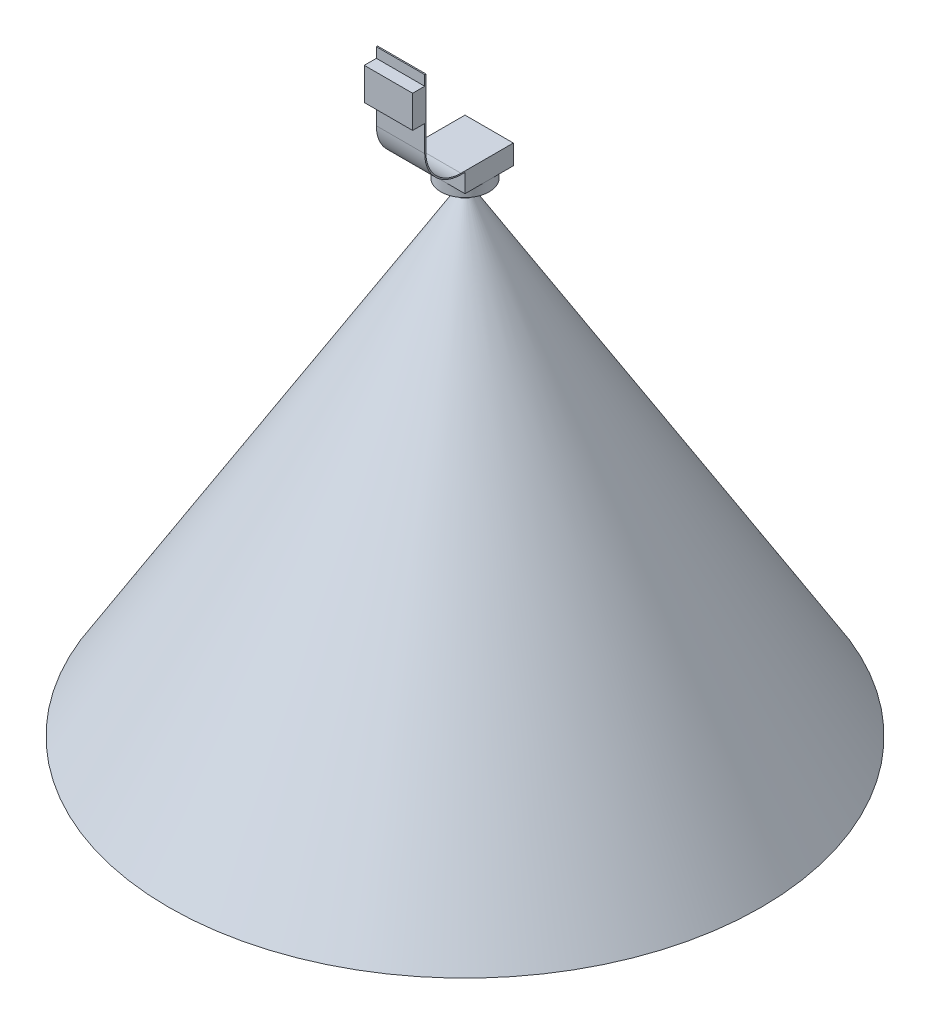
ISO-10303-21;
HEADER;
FILE_DESCRIPTION(('STEP AP214'),'2;1');
FILE_NAME('part.step','',(''),(''),'','','');
FILE_SCHEMA(('AUTOMOTIVE_DESIGN { 1 0 10303 214 1 1 1 1 }'));
ENDSEC;
DATA;
#1=APPLICATION_CONTEXT('core data for automotive mechanical design processes');
#2=APPLICATION_PROTOCOL_DEFINITION('international standard','automotive_design',2000,#1);
#3=PRODUCT_CONTEXT('',#1,'mechanical');
#4=PRODUCT('Part','Part','',(#3));
#5=PRODUCT_RELATED_PRODUCT_CATEGORY('part','',(#4));
#6=PRODUCT_DEFINITION_FORMATION('','',#4);
#7=PRODUCT_DEFINITION_CONTEXT('part definition',#1,'design');
#8=PRODUCT_DEFINITION('design','',#6,#7);
#9=PRODUCT_DEFINITION_SHAPE('','',#8);
#10=(LENGTH_UNIT() NAMED_UNIT(*) SI_UNIT(.MILLI.,.METRE.));
#11=(NAMED_UNIT(*) PLANE_ANGLE_UNIT() SI_UNIT($,.RADIAN.));
#12=(NAMED_UNIT(*) SI_UNIT($,.STERADIAN.) SOLID_ANGLE_UNIT());
#13=UNCERTAINTY_MEASURE_WITH_UNIT(LENGTH_MEASURE(1.E-05),#10,'distance_accuracy_value','');
#14=(GEOMETRIC_REPRESENTATION_CONTEXT(3) GLOBAL_UNCERTAINTY_ASSIGNED_CONTEXT((#13)) GLOBAL_UNIT_ASSIGNED_CONTEXT((#10,
#11,#12)) REPRESENTATION_CONTEXT('',''));
#15=CARTESIAN_POINT('',(0.,0.,0.));
#16=DIRECTION('',(0.,0.,1.));
#17=DIRECTION('',(1.,0.,0.));
#18=AXIS2_PLACEMENT_3D('',#15,#16,#17);
#19=CARTESIAN_POINT('',(-3.,13.,0.));
#20=DIRECTION('',(0.,0.,1.));
#21=DIRECTION('',(1.,0.,0.));
#22=AXIS2_PLACEMENT_3D('',#19,#20,#21);
#23=PLANE('',#22);
#24=DIRECTION('',(0.,1.,0.));
#25=VECTOR('',#24,1.);
#26=CARTESIAN_POINT('',(-3.,13.,0.));
#27=LINE('',#26,#25);
#28=CARTESIAN_POINT('',(-3.,13.,0.));
#29=VERTEX_POINT('',#28);
#30=CARTESIAN_POINT('',(-3.,11.75,0.));
#31=VERTEX_POINT('',#30);
#32=EDGE_CURVE('E393',#29,#31,#27,.F.);
#33=ORIENTED_EDGE('',*,*,#32,.T.);
#34=DIRECTION('',(1.,0.,0.));
#35=VECTOR('',#34,1.);
#36=CARTESIAN_POINT('',(3.,11.75,0.));
#37=LINE('',#36,#35);
#38=CARTESIAN_POINT('',(3.,11.75,0.));
#39=VERTEX_POINT('',#38);
#40=EDGE_CURVE('E362',#39,#31,#37,.F.);
#41=ORIENTED_EDGE('',*,*,#40,.F.);
#42=DIRECTION('',(0.,1.,0.));
#43=VECTOR('',#42,1.);
#44=CARTESIAN_POINT('',(3.,13.,0.));
#45=LINE('',#44,#43);
#46=CARTESIAN_POINT('',(3.,13.,0.));
#47=VERTEX_POINT('',#46);
#48=EDGE_CURVE('E398',#39,#47,#45,.T.);
#49=ORIENTED_EDGE('',*,*,#48,.T.);
#50=DIRECTION('',(1.,0.,0.));
#51=VECTOR('',#50,1.);
#52=CARTESIAN_POINT('',(-3.,13.,0.));
#53=LINE('',#52,#51);
#54=EDGE_CURVE('E376',#29,#47,#53,.T.);
#55=ORIENTED_EDGE('',*,*,#54,.F.);
#56=EDGE_LOOP('',(#33,#41,#49,#55));
#57=FACE_BOUND('',#56,.T.);
#58=ADVANCED_FACE('F16',(#57),#23,.T.);
#59=CARTESIAN_POINT('',(-3.,13.,-0.15));
#60=DIRECTION('',(0.,1.,0.));
#61=DIRECTION('',(0.,0.,1.));
#62=AXIS2_PLACEMENT_3D('',#59,#60,#61);
#63=PLANE('',#62);
#64=DIRECTION('',(-1.,0.,0.));
#65=VECTOR('',#64,1.);
#66=CARTESIAN_POINT('',(-3.,13.,-0.15));
#67=LINE('',#66,#65);
#68=CARTESIAN_POINT('',(-3.,13.,-0.15));
#69=VERTEX_POINT('',#68);
#70=CARTESIAN_POINT('',(3.,13.,-0.15));
#71=VERTEX_POINT('',#70);
#72=EDGE_CURVE('E343',#69,#71,#67,.F.);
#73=ORIENTED_EDGE('',*,*,#72,.F.);
#74=DIRECTION('',(0.,0.,1.));
#75=VECTOR('',#74,1.);
#76=CARTESIAN_POINT('',(-3.,13.,-0.15));
#77=LINE('',#76,#75);
#78=EDGE_CURVE('E368',#69,#29,#77,.T.);
#79=ORIENTED_EDGE('',*,*,#78,.T.);
#80=ORIENTED_EDGE('',*,*,#54,.T.);
#81=DIRECTION('',(0.,0.,1.));
#82=VECTOR('',#81,1.);
#83=CARTESIAN_POINT('',(3.,13.,-0.15));
#84=LINE('',#83,#82);
#85=EDGE_CURVE('E372',#47,#71,#84,.F.);
#86=ORIENTED_EDGE('',*,*,#85,.T.);
#87=EDGE_LOOP('',(#73,#79,#80,#86));
#88=FACE_BOUND('',#87,.T.);
#89=ADVANCED_FACE('F468',(#88),#63,.T.);
#90=CARTESIAN_POINT('',(3.,11.75,0.));
#91=DIRECTION('',(0.,1.,0.));
#92=DIRECTION('',(0.,0.,1.));
#93=AXIS2_PLACEMENT_3D('',#90,#91,#92);
#94=PLANE('',#93);
#95=DIRECTION('',(0.,0.,1.));
#96=VECTOR('',#95,1.);
#97=CARTESIAN_POINT('',(3.,11.75,0.));
#98=LINE('',#97,#96);
#99=CARTESIAN_POINT('',(3.,11.75,1.5));
#100=VERTEX_POINT('',#99);
#101=EDGE_CURVE('E406',#100,#39,#98,.F.);
#102=ORIENTED_EDGE('',*,*,#101,.T.);
#103=ORIENTED_EDGE('',*,*,#40,.T.);
#104=DIRECTION('',(0.,0.,1.));
#105=VECTOR('',#104,1.);
#106=CARTESIAN_POINT('',(-3.,11.75,0.));
#107=LINE('',#106,#105);
#108=CARTESIAN_POINT('',(-3.,11.75,1.5));
#109=VERTEX_POINT('',#108);
#110=EDGE_CURVE('E371',#31,#109,#107,.T.);
#111=ORIENTED_EDGE('',*,*,#110,.T.);
#112=DIRECTION('',(1.,0.,0.));
#113=VECTOR('',#112,1.);
#114=CARTESIAN_POINT('',(-3.,11.75,1.5));
#115=LINE('',#114,#113);
#116=EDGE_CURVE('E342',#100,#109,#115,.F.);
#117=ORIENTED_EDGE('',*,*,#116,.F.);
#118=EDGE_LOOP('',(#102,#103,#111,#117));
#119=FACE_BOUND('',#118,.T.);
#120=ADVANCED_FACE('F463',(#119),#94,.T.);
#121=CARTESIAN_POINT('',(-3.,7.75,0.));
#122=DIRECTION('',(0.,-1.,0.));
#123=DIRECTION('',(0.,0.,-1.));
#124=AXIS2_PLACEMENT_3D('',#121,#122,#123);
#125=PLANE('',#124);
#126=DIRECTION('',(0.,0.,-1.));
#127=VECTOR('',#126,1.);
#128=CARTESIAN_POINT('',(-3.,7.75,0.));
#129=LINE('',#128,#127);
#130=CARTESIAN_POINT('',(-3.,7.75,1.5));
#131=VERTEX_POINT('',#130);
#132=CARTESIAN_POINT('',(-3.,7.75,0.));
#133=VERTEX_POINT('',#132);
#134=EDGE_CURVE('E357',#131,#133,#129,.T.);
#135=ORIENTED_EDGE('',*,*,#134,.T.);
#136=DIRECTION('',(1.,0.,0.));
#137=VECTOR('',#136,1.);
#138=CARTESIAN_POINT('',(-3.,7.75,0.));
#139=LINE('',#138,#137);
#140=CARTESIAN_POINT('',(3.,7.75,0.));
#141=VERTEX_POINT('',#140);
#142=EDGE_CURVE('E332',#141,#133,#139,.F.);
#143=ORIENTED_EDGE('',*,*,#142,.F.);
#144=DIRECTION('',(0.,0.,-1.));
#145=VECTOR('',#144,1.);
#146=CARTESIAN_POINT('',(3.,7.75,0.));
#147=LINE('',#146,#145);
#148=CARTESIAN_POINT('',(3.,7.75,1.5));
#149=VERTEX_POINT('',#148);
#150=EDGE_CURVE('E360',#141,#149,#147,.F.);
#151=ORIENTED_EDGE('',*,*,#150,.T.);
#152=DIRECTION('',(1.,0.,0.));
#153=VECTOR('',#152,1.);
#154=CARTESIAN_POINT('',(-3.,7.75,1.5));
#155=LINE('',#154,#153);
#156=EDGE_CURVE('E333',#131,#149,#155,.T.);
#157=ORIENTED_EDGE('',*,*,#156,.F.);
#158=EDGE_LOOP('',(#135,#143,#151,#157));
#159=FACE_BOUND('',#158,.T.);
#160=ADVANCED_FACE('F456',(#159),#125,.T.);
#161=CARTESIAN_POINT('',(-3.,0.,-4.5));
#162=DIRECTION('',(0.,-1.,0.));
#163=DIRECTION('',(0.,0.,-1.));
#164=AXIS2_PLACEMENT_3D('',#161,#162,#163);
#165=PLANE('',#164);
#166=DIRECTION('',(0.,0.,-1.));
#167=VECTOR('',#166,1.);
#168=CARTESIAN_POINT('',(-3.,0.,0.));
#169=LINE('',#168,#167);
#170=CARTESIAN_POINT('',(-3.,0.,-4.5));
#171=VERTEX_POINT('',#170);
#172=CARTESIAN_POINT('',(-3.,0.,-5.));
#173=VERTEX_POINT('',#172);
#174=EDGE_CURVE('E162',#171,#173,#169,.T.);
#175=ORIENTED_EDGE('',*,*,#174,.T.);
#176=DIRECTION('',(1.,0.,0.));
#177=VECTOR('',#176,1.);
#178=CARTESIAN_POINT('',(-3.,0.,-5.));
#179=LINE('',#178,#177);
#180=CARTESIAN_POINT('',(3.,0.,-5.));
#181=VERTEX_POINT('',#180);
#182=EDGE_CURVE('E322',#181,#173,#179,.F.);
#183=ORIENTED_EDGE('',*,*,#182,.F.);
#184=DIRECTION('',(0.,0.,-1.));
#185=VECTOR('',#184,1.);
#186=CARTESIAN_POINT('',(3.,0.,-4.5));
#187=LINE('',#186,#185);
#188=CARTESIAN_POINT('',(3.,0.,-4.5));
#189=VERTEX_POINT('',#188);
#190=EDGE_CURVE('E164',#181,#189,#187,.F.);
#191=ORIENTED_EDGE('',*,*,#190,.T.);
#192=DIRECTION('',(1.,0.,0.));
#193=VECTOR('',#192,1.);
#194=CARTESIAN_POINT('',(-3.,0.,-4.5));
#195=LINE('',#194,#193);
#196=EDGE_CURVE('E158',#171,#189,#195,.T.);
#197=ORIENTED_EDGE('',*,*,#196,.F.);
#198=EDGE_LOOP('',(#175,#183,#191,#197));
#199=FACE_BOUND('',#198,.T.);
#200=ADVANCED_FACE('F159',(#199),#165,.T.);
#201=CARTESIAN_POINT('',(-3.,4.5,-4.5));
#202=DIRECTION('',(1.,0.,0.));
#203=DIRECTION('',(0.,0.,-1.));
#204=AXIS2_PLACEMENT_3D('',#201,#202,#203);
#205=CYLINDRICAL_SURFACE('',#204,4.5);
#206=DIRECTION('',(1.,0.,0.));
#207=VECTOR('',#206,1.);
#208=CARTESIAN_POINT('',(-3.,4.5,0.));
#209=LINE('',#208,#207);
#210=CARTESIAN_POINT('',(-3.,4.5,0.));
#211=VERTEX_POINT('',#210);
#212=CARTESIAN_POINT('',(3.,4.5,0.));
#213=VERTEX_POINT('',#212);
#214=EDGE_CURVE('E153',#211,#213,#209,.T.);
#215=ORIENTED_EDGE('',*,*,#214,.F.);
#216=CARTESIAN_POINT('',(-3.,4.5,-4.5));
#217=DIRECTION('',(1.,0.,0.));
#218=DIRECTION('',(0.,0.,-1.));
#219=AXIS2_PLACEMENT_3D('',#216,#217,#218);
#220=CIRCLE('',#219,4.5);
#221=EDGE_CURVE('E20',#211,#171,#220,.T.);
#222=ORIENTED_EDGE('',*,*,#221,.T.);
#223=ORIENTED_EDGE('',*,*,#196,.T.);
#224=CARTESIAN_POINT('',(3.,4.5,-4.5));
#225=DIRECTION('',(1.,0.,0.));
#226=DIRECTION('',(0.,0.,-1.));
#227=AXIS2_PLACEMENT_3D('',#224,#225,#226);
#228=CIRCLE('',#227,4.5);
#229=EDGE_CURVE('E318',#213,#189,#228,.T.);
#230=ORIENTED_EDGE('',*,*,#229,.F.);
#231=EDGE_LOOP('',(#215,#222,#223,#230));
#232=FACE_BOUND('',#231,.T.);
#233=ADVANCED_FACE('F169',(#232),#205,.T.);
#234=CARTESIAN_POINT('',(-3.,0.15,-11.));
#235=DIRECTION('',(0.,1.,0.));
#236=DIRECTION('',(0.,0.,1.));
#237=AXIS2_PLACEMENT_3D('',#234,#235,#236);
#238=PLANE('',#237);
#239=DIRECTION('',(-1.,0.,0.));
#240=VECTOR('',#239,1.);
#241=CARTESIAN_POINT('',(-3.,0.15,-11.));
#242=LINE('',#241,#240);
#243=CARTESIAN_POINT('',(-3.,0.15,-11.));
#244=VERTEX_POINT('',#243);
#245=CARTESIAN_POINT('',(3.,0.15,-11.));
#246=VERTEX_POINT('',#245);
#247=EDGE_CURVE('E336',#244,#246,#242,.F.);
#248=ORIENTED_EDGE('',*,*,#247,.F.);
#249=DIRECTION('',(0.,0.,-1.));
#250=VECTOR('',#249,1.);
#251=CARTESIAN_POINT('',(-3.,0.15,0.));
#252=LINE('',#251,#250);
#253=CARTESIAN_POINT('',(-3.,0.15,-4.5));
#254=VERTEX_POINT('',#253);
#255=EDGE_CURVE('E181',#244,#254,#252,.F.);
#256=ORIENTED_EDGE('',*,*,#255,.T.);
#257=DIRECTION('',(1.,0.,0.));
#258=VECTOR('',#257,1.);
#259=CARTESIAN_POINT('',(-3.,0.150000000000001,-4.5));
#260=LINE('',#259,#258);
#261=CARTESIAN_POINT('',(3.,0.15,-4.5));
#262=VERTEX_POINT('',#261);
#263=EDGE_CURVE('E166',#254,#262,#260,.T.);
#264=ORIENTED_EDGE('',*,*,#263,.T.);
#265=DIRECTION('',(0.,0.,-1.));
#266=VECTOR('',#265,1.);
#267=CARTESIAN_POINT('',(3.,0.15,0.));
#268=LINE('',#267,#266);
#269=EDGE_CURVE('E206',#246,#262,#268,.F.);
#270=ORIENTED_EDGE('',*,*,#269,.F.);
#271=EDGE_LOOP('',(#248,#256,#264,#270));
#272=FACE_BOUND('',#271,.T.);
#273=ADVANCED_FACE('F475',(#272),#238,.T.);
#274=CARTESIAN_POINT('',(-3.,4.5,-4.5));
#275=DIRECTION('',(1.,0.,0.));
#276=DIRECTION('',(0.,0.,-1.));
#277=AXIS2_PLACEMENT_3D('',#274,#275,#276);
#278=CYLINDRICAL_SURFACE('',#277,4.35);
#279=CARTESIAN_POINT('',(3.,4.5,-4.5));
#280=DIRECTION('',(1.,0.,0.));
#281=DIRECTION('',(0.,0.,-1.));
#282=AXIS2_PLACEMENT_3D('',#279,#280,#281);
#283=CIRCLE('',#282,4.35);
#284=CARTESIAN_POINT('',(3.,4.5,-0.15));
#285=VERTEX_POINT('',#284);
#286=EDGE_CURVE('E203',#262,#285,#283,.F.);
#287=ORIENTED_EDGE('',*,*,#286,.F.);
#288=ORIENTED_EDGE('',*,*,#263,.F.);
#289=CARTESIAN_POINT('',(-3.,4.5,-4.5));
#290=DIRECTION('',(1.,0.,0.));
#291=DIRECTION('',(0.,0.,-1.));
#292=AXIS2_PLACEMENT_3D('',#289,#290,#291);
#293=CIRCLE('',#292,4.35);
#294=CARTESIAN_POINT('',(-3.,4.5,-0.15));
#295=VERTEX_POINT('',#294);
#296=EDGE_CURVE('E434',#254,#295,#293,.F.);
#297=ORIENTED_EDGE('',*,*,#296,.T.);
#298=DIRECTION('',(-1.,0.,0.));
#299=VECTOR('',#298,1.);
#300=CARTESIAN_POINT('',(-3.,4.5,-0.15));
#301=LINE('',#300,#299);
#302=EDGE_CURVE('E339',#285,#295,#301,.T.);
#303=ORIENTED_EDGE('',*,*,#302,.F.);
#304=EDGE_LOOP('',(#287,#288,#297,#303));
#305=FACE_BOUND('',#304,.T.);
#306=ADVANCED_FACE('F473',(#305),#278,.F.);
#307=CARTESIAN_POINT('',(-3.,4.5,-0.15));
#308=DIRECTION('',(0.,0.,-1.));
#309=DIRECTION('',(-1.,0.,0.));
#310=AXIS2_PLACEMENT_3D('',#307,#308,#309);
#311=PLANE('',#310);
#312=ORIENTED_EDGE('',*,*,#302,.T.);
#313=DIRECTION('',(0.,1.,0.));
#314=VECTOR('',#313,1.);
#315=CARTESIAN_POINT('',(-3.,0.,-0.15));
#316=LINE('',#315,#314);
#317=EDGE_CURVE('E353',#295,#69,#316,.T.);
#318=ORIENTED_EDGE('',*,*,#317,.T.);
#319=ORIENTED_EDGE('',*,*,#72,.T.);
#320=DIRECTION('',(0.,1.,0.));
#321=VECTOR('',#320,1.);
#322=CARTESIAN_POINT('',(3.,0.,-0.15));
#323=LINE('',#322,#321);
#324=EDGE_CURVE('E200',#285,#71,#323,.T.);
#325=ORIENTED_EDGE('',*,*,#324,.F.);
#326=EDGE_LOOP('',(#312,#318,#319,#325));
#327=FACE_BOUND('',#326,.T.);
#328=ADVANCED_FACE('F471',(#327),#311,.T.);
#329=CARTESIAN_POINT('',(-3.,0.,1.5));
#330=DIRECTION('',(0.,0.,1.));
#331=DIRECTION('',(1.,0.,0.));
#332=AXIS2_PLACEMENT_3D('',#329,#330,#331);
#333=PLANE('',#332);
#334=ORIENTED_EDGE('',*,*,#156,.T.);
#335=DIRECTION('',(0.,1.,0.));
#336=VECTOR('',#335,1.);
#337=CARTESIAN_POINT('',(3.,0.,1.5));
#338=LINE('',#337,#336);
#339=EDGE_CURVE('E197',#100,#149,#338,.F.);
#340=ORIENTED_EDGE('',*,*,#339,.F.);
#341=ORIENTED_EDGE('',*,*,#116,.T.);
#342=DIRECTION('',(0.,1.,0.));
#343=VECTOR('',#342,1.);
#344=CARTESIAN_POINT('',(-3.,0.,1.5));
#345=LINE('',#344,#343);
#346=EDGE_CURVE('E190',#109,#131,#345,.F.);
#347=ORIENTED_EDGE('',*,*,#346,.T.);
#348=EDGE_LOOP('',(#334,#340,#341,#347));
#349=FACE_BOUND('',#348,.T.);
#350=ADVANCED_FACE('F450',(#349),#333,.T.);
#351=CARTESIAN_POINT('',(-3.,13.,0.));
#352=DIRECTION('',(0.,0.,1.));
#353=DIRECTION('',(1.,0.,0.));
#354=AXIS2_PLACEMENT_3D('',#351,#352,#353);
#355=PLANE('',#354);
#356=DIRECTION('',(0.,1.,0.));
#357=VECTOR('',#356,1.);
#358=CARTESIAN_POINT('',(3.,0.,0.));
#359=LINE('',#358,#357);
#360=EDGE_CURVE('E193',#141,#213,#359,.F.);
#361=ORIENTED_EDGE('',*,*,#360,.F.);
#362=ORIENTED_EDGE('',*,*,#142,.T.);
#363=DIRECTION('',(0.,1.,0.));
#364=VECTOR('',#363,1.);
#365=CARTESIAN_POINT('',(-3.,0.,0.));
#366=LINE('',#365,#364);
#367=EDGE_CURVE('E172',#133,#211,#366,.F.);
#368=ORIENTED_EDGE('',*,*,#367,.T.);
#369=ORIENTED_EDGE('',*,*,#214,.T.);
#370=EDGE_LOOP('',(#361,#362,#368,#369));
#371=FACE_BOUND('',#370,.T.);
#372=ADVANCED_FACE('F503',(#371),#355,.T.);
#373=CARTESIAN_POINT('',(-3.,0.,-11.));
#374=DIRECTION('',(0.,0.,-1.));
#375=DIRECTION('',(-1.,0.,0.));
#376=AXIS2_PLACEMENT_3D('',#373,#374,#375);
#377=PLANE('',#376);
#378=DIRECTION('',(1.,0.,0.));
#379=VECTOR('',#378,1.);
#380=CARTESIAN_POINT('',(-3.,-2.3,-11.));
#381=LINE('',#380,#379);
#382=CARTESIAN_POINT('',(3.,-2.3,-11.));
#383=VERTEX_POINT('',#382);
#384=CARTESIAN_POINT('',(0.,-2.3,-11.));
#385=VERTEX_POINT('',#384);
#386=EDGE_CURVE('E212',#383,#385,#381,.F.);
#387=ORIENTED_EDGE('',*,*,#386,.T.);
#388=DIRECTION('',(1.,0.,0.));
#389=VECTOR('',#388,1.);
#390=CARTESIAN_POINT('',(-3.,-2.3,-11.));
#391=LINE('',#390,#389);
#392=CARTESIAN_POINT('',(-3.,-2.3,-11.));
#393=VERTEX_POINT('',#392);
#394=EDGE_CURVE('E214',#385,#393,#391,.F.);
#395=ORIENTED_EDGE('',*,*,#394,.T.);
#396=DIRECTION('',(0.,1.,0.));
#397=VECTOR('',#396,1.);
#398=CARTESIAN_POINT('',(-3.,0.,-11.));
#399=LINE('',#398,#397);
#400=EDGE_CURVE('E178',#393,#244,#399,.T.);
#401=ORIENTED_EDGE('',*,*,#400,.T.);
#402=ORIENTED_EDGE('',*,*,#247,.T.);
#403=DIRECTION('',(0.,1.,0.));
#404=VECTOR('',#403,1.);
#405=CARTESIAN_POINT('',(3.,0.,-11.));
#406=LINE('',#405,#404);
#407=EDGE_CURVE('E209',#383,#246,#406,.T.);
#408=ORIENTED_EDGE('',*,*,#407,.F.);
#409=EDGE_LOOP('',(#387,#395,#401,#402,#408));
#410=FACE_BOUND('',#409,.T.);
#411=ADVANCED_FACE('F478',(#410),#377,.T.);
#412=CARTESIAN_POINT('',(-3.,0.,0.));
#413=DIRECTION('',(1.,0.,0.));
#414=DIRECTION('',(0.,0.,-1.));
#415=AXIS2_PLACEMENT_3D('',#412,#413,#414);
#416=PLANE('',#415);
#417=ORIENTED_EDGE('',*,*,#317,.F.);
#418=ORIENTED_EDGE('',*,*,#296,.F.);
#419=ORIENTED_EDGE('',*,*,#255,.F.);
#420=ORIENTED_EDGE('',*,*,#400,.F.);
#421=DIRECTION('',(0.,0.,1.));
#422=VECTOR('',#421,1.);
#423=CARTESIAN_POINT('',(-3.,-2.3,0.));
#424=LINE('',#423,#422);
#425=CARTESIAN_POINT('',(-3.,-2.3,-8.));
#426=VERTEX_POINT('',#425);
#427=EDGE_CURVE('E221',#393,#426,#424,.T.);
#428=ORIENTED_EDGE('',*,*,#427,.T.);
#429=DIRECTION('',(0.,0.,1.));
#430=VECTOR('',#429,1.);
#431=CARTESIAN_POINT('',(-3.,-2.3,0.));
#432=LINE('',#431,#430);
#433=CARTESIAN_POINT('',(-3.,-2.3,-5.));
#434=VERTEX_POINT('',#433);
#435=EDGE_CURVE('E223',#426,#434,#432,.T.);
#436=ORIENTED_EDGE('',*,*,#435,.T.);
#437=DIRECTION('',(0.,1.,0.));
#438=VECTOR('',#437,1.);
#439=CARTESIAN_POINT('',(-3.,0.,-5.));
#440=LINE('',#439,#438);
#441=EDGE_CURVE('E176',#173,#434,#440,.F.);
#442=ORIENTED_EDGE('',*,*,#441,.F.);
#443=ORIENTED_EDGE('',*,*,#174,.F.);
#444=ORIENTED_EDGE('',*,*,#221,.F.);
#445=ORIENTED_EDGE('',*,*,#367,.F.);
#446=ORIENTED_EDGE('',*,*,#134,.F.);
#447=ORIENTED_EDGE('',*,*,#346,.F.);
#448=ORIENTED_EDGE('',*,*,#110,.F.);
#449=ORIENTED_EDGE('',*,*,#32,.F.);
#450=ORIENTED_EDGE('',*,*,#78,.F.);
#451=EDGE_LOOP('',(#417,#418,#419,#420,#428,#436,#442,#443,#444,#445,#446,#447,#448,#449,#450));
#452=FACE_BOUND('',#451,.T.);
#453=ADVANCED_FACE('F174',(#452),#416,.F.);
#454=CARTESIAN_POINT('',(-3.,0.,-5.));
#455=DIRECTION('',(0.,0.,1.));
#456=DIRECTION('',(1.,0.,0.));
#457=AXIS2_PLACEMENT_3D('',#454,#455,#456);
#458=PLANE('',#457);
#459=DIRECTION('',(1.,0.,0.));
#460=VECTOR('',#459,1.);
#461=CARTESIAN_POINT('',(-3.,-2.3,-5.));
#462=LINE('',#461,#460);
#463=CARTESIAN_POINT('',(0.,-2.3,-5.));
#464=VERTEX_POINT('',#463);
#465=EDGE_CURVE('E229',#434,#464,#462,.T.);
#466=ORIENTED_EDGE('',*,*,#465,.T.);
#467=DIRECTION('',(1.,0.,0.));
#468=VECTOR('',#467,1.);
#469=CARTESIAN_POINT('',(-3.,-2.3,-5.));
#470=LINE('',#469,#468);
#471=CARTESIAN_POINT('',(3.,-2.3,-5.));
#472=VERTEX_POINT('',#471);
#473=EDGE_CURVE('E231',#464,#472,#470,.T.);
#474=ORIENTED_EDGE('',*,*,#473,.T.);
#475=DIRECTION('',(0.,1.,0.));
#476=VECTOR('',#475,1.);
#477=CARTESIAN_POINT('',(3.,0.,-5.));
#478=LINE('',#477,#476);
#479=EDGE_CURVE('E315',#181,#472,#478,.F.);
#480=ORIENTED_EDGE('',*,*,#479,.F.);
#481=ORIENTED_EDGE('',*,*,#182,.T.);
#482=ORIENTED_EDGE('',*,*,#441,.T.);
#483=EDGE_LOOP('',(#466,#474,#480,#481,#482));
#484=FACE_BOUND('',#483,.T.);
#485=ADVANCED_FACE('F499',(#484),#458,.T.);
#486=CARTESIAN_POINT('',(3.,0.,0.));
#487=DIRECTION('',(1.,0.,0.));
#488=DIRECTION('',(0.,0.,-1.));
#489=AXIS2_PLACEMENT_3D('',#486,#487,#488);
#490=PLANE('',#489);
#491=ORIENTED_EDGE('',*,*,#150,.F.);
#492=ORIENTED_EDGE('',*,*,#360,.T.);
#493=ORIENTED_EDGE('',*,*,#229,.T.);
#494=ORIENTED_EDGE('',*,*,#190,.F.);
#495=ORIENTED_EDGE('',*,*,#479,.T.);
#496=DIRECTION('',(0.,0.,1.));
#497=VECTOR('',#496,1.);
#498=CARTESIAN_POINT('',(3.,-2.3,0.));
#499=LINE('',#498,#497);
#500=CARTESIAN_POINT('',(3.,-2.3,-8.));
#501=VERTEX_POINT('',#500);
#502=EDGE_CURVE('E237',#472,#501,#499,.F.);
#503=ORIENTED_EDGE('',*,*,#502,.T.);
#504=DIRECTION('',(0.,0.,1.));
#505=VECTOR('',#504,1.);
#506=CARTESIAN_POINT('',(3.,-2.3,0.));
#507=LINE('',#506,#505);
#508=EDGE_CURVE('E196',#501,#383,#507,.F.);
#509=ORIENTED_EDGE('',*,*,#508,.T.);
#510=ORIENTED_EDGE('',*,*,#407,.T.);
#511=ORIENTED_EDGE('',*,*,#269,.T.);
#512=ORIENTED_EDGE('',*,*,#286,.T.);
#513=ORIENTED_EDGE('',*,*,#324,.T.);
#514=ORIENTED_EDGE('',*,*,#85,.F.);
#515=ORIENTED_EDGE('',*,*,#48,.F.);
#516=ORIENTED_EDGE('',*,*,#101,.F.);
#517=ORIENTED_EDGE('',*,*,#339,.T.);
#518=EDGE_LOOP('',(#491,#492,#493,#494,#495,#503,#509,#510,#511,#512,#513,#514,#515,#516,#517));
#519=FACE_BOUND('',#518,.T.);
#520=ADVANCED_FACE('F459',(#519),#490,.T.);
#521=CARTESIAN_POINT('',(-3.,-2.3,0.));
#522=DIRECTION('',(0.,1.,0.));
#523=DIRECTION('',(0.,0.,1.));
#524=AXIS2_PLACEMENT_3D('',#521,#522,#523);
#525=PLANE('',#524);
#526=ORIENTED_EDGE('',*,*,#386,.F.);
#527=ORIENTED_EDGE('',*,*,#508,.F.);
#528=CARTESIAN_POINT('',(0.,-2.3,-8.));
#529=DIRECTION('',(0.,-1.,0.));
#530=DIRECTION('',(0.,0.,-1.));
#531=AXIS2_PLACEMENT_3D('',#528,#529,#530);
#532=CIRCLE('',#531,3.);
#533=EDGE_CURVE('E239',#385,#501,#532,.T.);
#534=ORIENTED_EDGE('',*,*,#533,.F.);
#535=EDGE_LOOP('',(#526,#527,#534));
#536=FACE_BOUND('',#535,.T.);
#537=ADVANCED_FACE('F609',(#536),#525,.F.);
#538=CARTESIAN_POINT('',(-3.,-2.3,0.));
#539=DIRECTION('',(0.,1.,0.));
#540=DIRECTION('',(0.,0.,1.));
#541=AXIS2_PLACEMENT_3D('',#538,#539,#540);
#542=PLANE('',#541);
#543=ORIENTED_EDGE('',*,*,#394,.F.);
#544=CARTESIAN_POINT('',(0.,-2.3,-8.));
#545=DIRECTION('',(0.,-1.,0.));
#546=DIRECTION('',(0.,0.,-1.));
#547=AXIS2_PLACEMENT_3D('',#544,#545,#546);
#548=CIRCLE('',#547,3.);
#549=EDGE_CURVE('E427',#426,#385,#548,.T.);
#550=ORIENTED_EDGE('',*,*,#549,.F.);
#551=ORIENTED_EDGE('',*,*,#427,.F.);
#552=EDGE_LOOP('',(#543,#550,#551));
#553=FACE_BOUND('',#552,.T.);
#554=ADVANCED_FACE('F483',(#553),#542,.F.);
#555=CARTESIAN_POINT('',(-3.,-2.3,0.));
#556=DIRECTION('',(0.,1.,0.));
#557=DIRECTION('',(0.,0.,1.));
#558=AXIS2_PLACEMENT_3D('',#555,#556,#557);
#559=PLANE('',#558);
#560=ORIENTED_EDGE('',*,*,#465,.F.);
#561=ORIENTED_EDGE('',*,*,#435,.F.);
#562=CARTESIAN_POINT('',(0.,-2.3,-8.));
#563=DIRECTION('',(0.,-1.,0.));
#564=DIRECTION('',(0.,0.,-1.));
#565=AXIS2_PLACEMENT_3D('',#562,#563,#564);
#566=CIRCLE('',#565,3.);
#567=EDGE_CURVE('E424',#464,#426,#566,.T.);
#568=ORIENTED_EDGE('',*,*,#567,.F.);
#569=EDGE_LOOP('',(#560,#561,#568));
#570=FACE_BOUND('',#569,.T.);
#571=ADVANCED_FACE('F489',(#570),#559,.F.);
#572=CARTESIAN_POINT('',(-3.,-2.3,0.));
#573=DIRECTION('',(0.,1.,0.));
#574=DIRECTION('',(0.,0.,1.));
#575=AXIS2_PLACEMENT_3D('',#572,#573,#574);
#576=PLANE('',#575);
#577=ORIENTED_EDGE('',*,*,#473,.F.);
#578=CARTESIAN_POINT('',(0.,-2.3,-8.));
#579=DIRECTION('',(0.,-1.,0.));
#580=DIRECTION('',(0.,0.,-1.));
#581=AXIS2_PLACEMENT_3D('',#578,#579,#580);
#582=CIRCLE('',#581,3.);
#583=EDGE_CURVE('E421',#501,#464,#582,.T.);
#584=ORIENTED_EDGE('',*,*,#583,.F.);
#585=ORIENTED_EDGE('',*,*,#502,.F.);
#586=EDGE_LOOP('',(#577,#584,#585));
#587=FACE_BOUND('',#586,.T.);
#588=ADVANCED_FACE('F496',(#587),#576,.F.);
#589=CARTESIAN_POINT('',(0.,-2.3,-8.));
#590=DIRECTION('',(0.,-1.,0.));
#591=DIRECTION('',(0.,0.,-1.));
#592=AXIS2_PLACEMENT_3D('',#589,#590,#591);
#593=CYLINDRICAL_SURFACE('',#592,3.);
#594=CARTESIAN_POINT('',(0.,-3.6,-8.));
#595=DIRECTION('',(0.,-1.,0.));
#596=DIRECTION('',(0.,0.,-1.));
#597=AXIS2_PLACEMENT_3D('',#594,#595,#596);
#598=CIRCLE('',#597,3.);
#599=CARTESIAN_POINT('',(0.,-3.6,-11.));
#600=VERTEX_POINT('',#599);
#601=EDGE_CURVE('E249',#600,#600,#598,.T.);
#602=ORIENTED_EDGE('',*,*,#601,.F.);
#603=EDGE_LOOP('',(#602));
#604=FACE_BOUND('',#603,.T.);
#605=ORIENTED_EDGE('',*,*,#567,.T.);
#606=ORIENTED_EDGE('',*,*,#549,.T.);
#607=ORIENTED_EDGE('',*,*,#533,.T.);
#608=ORIENTED_EDGE('',*,*,#583,.T.);
#609=EDGE_LOOP('',(#605,#606,#607,#608));
#610=FACE_BOUND('',#609,.T.);
#611=ADVANCED_FACE('F491',(#604,#610),#593,.T.);
#612=CARTESIAN_POINT('',(-3.,-3.6,0.));
#613=DIRECTION('',(0.,-1.,0.));
#614=DIRECTION('',(0.,0.,-1.));
#615=AXIS2_PLACEMENT_3D('',#612,#613,#614);
#616=PLANE('',#615);
#617=DIRECTION('',(0.,0.,-1.));
#618=VECTOR('',#617,1.);
#619=CARTESIAN_POINT('',(2.,-3.6,-9.5));
#620=LINE('',#619,#618);
#621=CARTESIAN_POINT('',(2.,-3.6,-9.5));
#622=VERTEX_POINT('',#621);
#623=CARTESIAN_POINT('',(2.,-3.6,-6.5));
#624=VERTEX_POINT('',#623);
#625=EDGE_CURVE('E248',#622,#624,#620,.F.);
#626=ORIENTED_EDGE('',*,*,#625,.F.);
#627=DIRECTION('',(-0.707106781186547,0.,-0.707106781186548));
#628=VECTOR('',#627,1.);
#629=CARTESIAN_POINT('',(2.,-3.6,-9.5));
#630=LINE('',#629,#628);
#631=CARTESIAN_POINT('',(1.5,-3.6,-10.));
#632=VERTEX_POINT('',#631);
#633=EDGE_CURVE('E245',#622,#632,#630,.T.);
#634=ORIENTED_EDGE('',*,*,#633,.T.);
#635=DIRECTION('',(-1.,0.,0.));
#636=VECTOR('',#635,1.);
#637=CARTESIAN_POINT('',(-1.5,-3.6,-10.));
#638=LINE('',#637,#636);
#639=CARTESIAN_POINT('',(-1.5,-3.6,-10.));
#640=VERTEX_POINT('',#639);
#641=EDGE_CURVE('E283',#640,#632,#638,.F.);
#642=ORIENTED_EDGE('',*,*,#641,.F.);
#643=DIRECTION('',(-0.707106781186548,0.,0.707106781186548));
#644=VECTOR('',#643,1.);
#645=CARTESIAN_POINT('',(-2.,-3.6,-9.5));
#646=LINE('',#645,#644);
#647=CARTESIAN_POINT('',(-2.,-3.6,-9.5));
#648=VERTEX_POINT('',#647);
#649=EDGE_CURVE('E277',#648,#640,#646,.F.);
#650=ORIENTED_EDGE('',*,*,#649,.F.);
#651=DIRECTION('',(0.,0.,1.));
#652=VECTOR('',#651,1.);
#653=CARTESIAN_POINT('',(-2.,-3.6,-6.5));
#654=LINE('',#653,#652);
#655=CARTESIAN_POINT('',(-2.,-3.6,-6.5));
#656=VERTEX_POINT('',#655);
#657=EDGE_CURVE('E271',#656,#648,#654,.F.);
#658=ORIENTED_EDGE('',*,*,#657,.F.);
#659=DIRECTION('',(0.707106781186548,0.,0.707106781186548));
#660=VECTOR('',#659,1.);
#661=CARTESIAN_POINT('',(-1.5,-3.6,-6.));
#662=LINE('',#661,#660);
#663=CARTESIAN_POINT('',(-1.5,-3.6,-6.));
#664=VERTEX_POINT('',#663);
#665=EDGE_CURVE('E265',#664,#656,#662,.F.);
#666=ORIENTED_EDGE('',*,*,#665,.F.);
#667=DIRECTION('',(1.,0.,0.));
#668=VECTOR('',#667,1.);
#669=CARTESIAN_POINT('',(1.5,-3.6,-6.));
#670=LINE('',#669,#668);
#671=CARTESIAN_POINT('',(1.5,-3.6,-6.));
#672=VERTEX_POINT('',#671);
#673=EDGE_CURVE('E259',#672,#664,#670,.F.);
#674=ORIENTED_EDGE('',*,*,#673,.F.);
#675=DIRECTION('',(0.707106781186548,0.,-0.707106781186548));
#676=VECTOR('',#675,1.);
#677=CARTESIAN_POINT('',(2.,-3.6,-6.5));
#678=LINE('',#677,#676);
#679=EDGE_CURVE('E253',#624,#672,#678,.F.);
#680=ORIENTED_EDGE('',*,*,#679,.F.);
#681=EDGE_LOOP('',(#626,#634,#642,#650,#658,#666,#674,#680));
#682=FACE_BOUND('',#681,.T.);
#683=ORIENTED_EDGE('',*,*,#601,.T.);
#684=EDGE_LOOP('',(#683));
#685=FACE_BOUND('',#684,.T.);
#686=ADVANCED_FACE('F539',(#682,#685),#616,.T.);
#687=CARTESIAN_POINT('',(2.,-3.6,-9.5));
#688=DIRECTION('',(1.,0.,0.));
#689=DIRECTION('',(0.,0.,-1.));
#690=AXIS2_PLACEMENT_3D('',#687,#688,#689);
#691=PLANE('',#690);
#692=DIRECTION('',(0.,1.,0.));
#693=VECTOR('',#692,1.);
#694=CARTESIAN_POINT('',(2.,-3.6,-9.5));
#695=LINE('',#694,#693);
#696=CARTESIAN_POINT('',(2.,-4.,-9.5));
#697=VERTEX_POINT('',#696);
#698=EDGE_CURVE('E285',#622,#697,#695,.F.);
#699=ORIENTED_EDGE('',*,*,#698,.F.);
#700=ORIENTED_EDGE('',*,*,#625,.T.);
#701=DIRECTION('',(0.,1.,0.));
#702=VECTOR('',#701,1.);
#703=CARTESIAN_POINT('',(2.,-3.6,-6.5));
#704=LINE('',#703,#702);
#705=CARTESIAN_POINT('',(2.,-4.,-6.5));
#706=VERTEX_POINT('',#705);
#707=EDGE_CURVE('E252',#706,#624,#704,.T.);
#708=ORIENTED_EDGE('',*,*,#707,.F.);
#709=DIRECTION('',(0.,0.,-1.));
#710=VECTOR('',#709,1.);
#711=CARTESIAN_POINT('',(2.,-4.,0.));
#712=LINE('',#711,#710);
#713=EDGE_CURVE('E289',#697,#706,#712,.F.);
#714=ORIENTED_EDGE('',*,*,#713,.F.);
#715=EDGE_LOOP('',(#699,#700,#708,#714));
#716=FACE_BOUND('',#715,.T.);
#717=ADVANCED_FACE('F546',(#716),#691,.T.);
#718=CARTESIAN_POINT('',(2.,-3.6,-6.5));
#719=DIRECTION('',(0.707106781186548,0.,0.707106781186548));
#720=DIRECTION('',(0.707106781186548,0.,-0.707106781186548));
#721=AXIS2_PLACEMENT_3D('',#718,#719,#720);
#722=PLANE('',#721);
#723=ORIENTED_EDGE('',*,*,#707,.T.);
#724=ORIENTED_EDGE('',*,*,#679,.T.);
#725=DIRECTION('',(0.,1.,0.));
#726=VECTOR('',#725,1.);
#727=CARTESIAN_POINT('',(1.5,-3.6,-6.));
#728=LINE('',#727,#726);
#729=CARTESIAN_POINT('',(1.5,-4.,-6.));
#730=VERTEX_POINT('',#729);
#731=EDGE_CURVE('E256',#730,#672,#728,.T.);
#732=ORIENTED_EDGE('',*,*,#731,.F.);
#733=DIRECTION('',(-0.707106781186547,0.,0.707106781186548));
#734=VECTOR('',#733,1.);
#735=CARTESIAN_POINT('',(2.,-4.,-6.5));
#736=LINE('',#735,#734);
#737=EDGE_CURVE('E310',#706,#730,#736,.T.);
#738=ORIENTED_EDGE('',*,*,#737,.F.);
#739=EDGE_LOOP('',(#723,#724,#732,#738));
#740=FACE_BOUND('',#739,.T.);
#741=ADVANCED_FACE('F550',(#740),#722,.T.);
#742=CARTESIAN_POINT('',(1.5,-3.6,-6.));
#743=DIRECTION('',(0.,0.,1.));
#744=DIRECTION('',(1.,0.,0.));
#745=AXIS2_PLACEMENT_3D('',#742,#743,#744);
#746=PLANE('',#745);
#747=ORIENTED_EDGE('',*,*,#731,.T.);
#748=ORIENTED_EDGE('',*,*,#673,.T.);
#749=DIRECTION('',(0.,1.,0.));
#750=VECTOR('',#749,1.);
#751=CARTESIAN_POINT('',(-1.5,-3.6,-6.));
#752=LINE('',#751,#750);
#753=CARTESIAN_POINT('',(-1.5,-4.,-6.));
#754=VERTEX_POINT('',#753);
#755=EDGE_CURVE('E262',#754,#664,#752,.T.);
#756=ORIENTED_EDGE('',*,*,#755,.F.);
#757=DIRECTION('',(1.,0.,0.));
#758=VECTOR('',#757,1.);
#759=CARTESIAN_POINT('',(-3.,-4.,-6.));
#760=LINE('',#759,#758);
#761=EDGE_CURVE('E307',#730,#754,#760,.F.);
#762=ORIENTED_EDGE('',*,*,#761,.F.);
#763=EDGE_LOOP('',(#747,#748,#756,#762));
#764=FACE_BOUND('',#763,.T.);
#765=ADVANCED_FACE('F554',(#764),#746,.T.);
#766=CARTESIAN_POINT('',(-1.5,-3.6,-6.));
#767=DIRECTION('',(-0.707106781186548,0.,0.707106781186548));
#768=DIRECTION('',(0.707106781186548,0.,0.707106781186548));
#769=AXIS2_PLACEMENT_3D('',#766,#767,#768);
#770=PLANE('',#769);
#771=ORIENTED_EDGE('',*,*,#755,.T.);
#772=ORIENTED_EDGE('',*,*,#665,.T.);
#773=DIRECTION('',(0.,1.,0.));
#774=VECTOR('',#773,1.);
#775=CARTESIAN_POINT('',(-2.,-3.6,-6.5));
#776=LINE('',#775,#774);
#777=CARTESIAN_POINT('',(-2.,-4.,-6.5));
#778=VERTEX_POINT('',#777);
#779=EDGE_CURVE('E268',#778,#656,#776,.T.);
#780=ORIENTED_EDGE('',*,*,#779,.F.);
#781=DIRECTION('',(-0.707106781186547,0.,-0.707106781186548));
#782=VECTOR('',#781,1.);
#783=CARTESIAN_POINT('',(-1.5,-4.,-6.));
#784=LINE('',#783,#782);
#785=EDGE_CURVE('E304',#754,#778,#784,.T.);
#786=ORIENTED_EDGE('',*,*,#785,.F.);
#787=EDGE_LOOP('',(#771,#772,#780,#786));
#788=FACE_BOUND('',#787,.T.);
#789=ADVANCED_FACE('F559',(#788),#770,.T.);
#790=CARTESIAN_POINT('',(-2.,-3.6,-6.5));
#791=DIRECTION('',(-1.,0.,0.));
#792=DIRECTION('',(0.,0.,1.));
#793=AXIS2_PLACEMENT_3D('',#790,#791,#792);
#794=PLANE('',#793);
#795=ORIENTED_EDGE('',*,*,#779,.T.);
#796=ORIENTED_EDGE('',*,*,#657,.T.);
#797=DIRECTION('',(0.,1.,0.));
#798=VECTOR('',#797,1.);
#799=CARTESIAN_POINT('',(-2.,-3.6,-9.5));
#800=LINE('',#799,#798);
#801=CARTESIAN_POINT('',(-2.,-4.,-9.5));
#802=VERTEX_POINT('',#801);
#803=EDGE_CURVE('E274',#802,#648,#800,.T.);
#804=ORIENTED_EDGE('',*,*,#803,.F.);
#805=DIRECTION('',(0.,0.,-1.));
#806=VECTOR('',#805,1.);
#807=CARTESIAN_POINT('',(-2.,-4.,0.));
#808=LINE('',#807,#806);
#809=EDGE_CURVE('E301',#778,#802,#808,.T.);
#810=ORIENTED_EDGE('',*,*,#809,.F.);
#811=EDGE_LOOP('',(#795,#796,#804,#810));
#812=FACE_BOUND('',#811,.T.);
#813=ADVANCED_FACE('F562',(#812),#794,.T.);
#814=CARTESIAN_POINT('',(-2.,-3.6,-9.5));
#815=DIRECTION('',(-0.707106781186548,0.,-0.707106781186548));
#816=DIRECTION('',(-0.707106781186548,0.,0.707106781186548));
#817=AXIS2_PLACEMENT_3D('',#814,#815,#816);
#818=PLANE('',#817);
#819=ORIENTED_EDGE('',*,*,#803,.T.);
#820=ORIENTED_EDGE('',*,*,#649,.T.);
#821=DIRECTION('',(0.,1.,0.));
#822=VECTOR('',#821,1.);
#823=CARTESIAN_POINT('',(-1.5,-3.6,-10.));
#824=LINE('',#823,#822);
#825=CARTESIAN_POINT('',(-1.5,-4.,-10.));
#826=VERTEX_POINT('',#825);
#827=EDGE_CURVE('E280',#826,#640,#824,.T.);
#828=ORIENTED_EDGE('',*,*,#827,.F.);
#829=DIRECTION('',(0.707106781186547,0.,-0.707106781186548));
#830=VECTOR('',#829,1.);
#831=CARTESIAN_POINT('',(-2.,-4.,-9.5));
#832=LINE('',#831,#830);
#833=EDGE_CURVE('E298',#802,#826,#832,.T.);
#834=ORIENTED_EDGE('',*,*,#833,.F.);
#835=EDGE_LOOP('',(#819,#820,#828,#834));
#836=FACE_BOUND('',#835,.T.);
#837=ADVANCED_FACE('F534',(#836),#818,.T.);
#838=CARTESIAN_POINT('',(-1.5,-3.6,-10.));
#839=DIRECTION('',(0.,0.,-1.));
#840=DIRECTION('',(-1.,0.,0.));
#841=AXIS2_PLACEMENT_3D('',#838,#839,#840);
#842=PLANE('',#841);
#843=ORIENTED_EDGE('',*,*,#827,.T.);
#844=ORIENTED_EDGE('',*,*,#641,.T.);
#845=DIRECTION('',(0.,1.,0.));
#846=VECTOR('',#845,1.);
#847=CARTESIAN_POINT('',(1.5,-3.6,-10.));
#848=LINE('',#847,#846);
#849=CARTESIAN_POINT('',(1.5,-4.,-10.));
#850=VERTEX_POINT('',#849);
#851=EDGE_CURVE('E35',#850,#632,#848,.T.);
#852=ORIENTED_EDGE('',*,*,#851,.F.);
#853=DIRECTION('',(1.,0.,0.));
#854=VECTOR('',#853,1.);
#855=CARTESIAN_POINT('',(-3.,-4.,-10.));
#856=LINE('',#855,#854);
#857=EDGE_CURVE('E295',#826,#850,#856,.T.);
#858=ORIENTED_EDGE('',*,*,#857,.F.);
#859=EDGE_LOOP('',(#843,#844,#852,#858));
#860=FACE_BOUND('',#859,.T.);
#861=ADVANCED_FACE('F528',(#860),#842,.T.);
#862=CARTESIAN_POINT('',(1.5,-3.6,-10.));
#863=DIRECTION('',(0.707106781186548,0.,-0.707106781186548));
#864=DIRECTION('',(-0.707106781186548,0.,-0.707106781186548));
#865=AXIS2_PLACEMENT_3D('',#862,#863,#864);
#866=PLANE('',#865);
#867=ORIENTED_EDGE('',*,*,#851,.T.);
#868=ORIENTED_EDGE('',*,*,#633,.F.);
#869=ORIENTED_EDGE('',*,*,#698,.T.);
#870=DIRECTION('',(0.707106781186547,0.,0.707106781186548));
#871=VECTOR('',#870,1.);
#872=CARTESIAN_POINT('',(1.5,-4.,-10.));
#873=LINE('',#872,#871);
#874=EDGE_CURVE('E292',#850,#697,#873,.T.);
#875=ORIENTED_EDGE('',*,*,#874,.F.);
#876=EDGE_LOOP('',(#867,#868,#869,#875));
#877=FACE_BOUND('',#876,.T.);
#878=ADVANCED_FACE('F525',(#877),#866,.T.);
#879=CARTESIAN_POINT('',(-3.,-4.,0.));
#880=DIRECTION('',(0.,-1.,0.));
#881=DIRECTION('',(0.,0.,-1.));
#882=AXIS2_PLACEMENT_3D('',#879,#880,#881);
#883=PLANE('',#882);
#884=CARTESIAN_POINT('',(0.,-3.99999999999957,-8.));
#885=DIRECTION('',(0.,-1.,0.));
#886=DIRECTION('',(0.,0.,-1.));
#887=AXIS2_PLACEMENT_3D('',#884,#885,#886);
#888=CIRCLE('',#887,0.24512031525669);
#889=CARTESIAN_POINT('',(0.,-3.99999999999957,-8.24512031525669));
#890=VERTEX_POINT('',#889);
#891=EDGE_CURVE('E26',#890,#890,#888,.T.);
#892=ORIENTED_EDGE('',*,*,#891,.F.);
#893=EDGE_LOOP('',(#892));
#894=FACE_BOUND('',#893,.T.);
#895=ORIENTED_EDGE('',*,*,#857,.T.);
#896=ORIENTED_EDGE('',*,*,#874,.T.);
#897=ORIENTED_EDGE('',*,*,#713,.T.);
#898=ORIENTED_EDGE('',*,*,#737,.T.);
#899=ORIENTED_EDGE('',*,*,#761,.T.);
#900=ORIENTED_EDGE('',*,*,#785,.T.);
#901=ORIENTED_EDGE('',*,*,#809,.T.);
#902=ORIENTED_EDGE('',*,*,#833,.T.);
#903=EDGE_LOOP('',(#895,#896,#897,#898,#899,#900,#901,#902));
#904=FACE_BOUND('',#903,.T.);
#905=ADVANCED_FACE('F517',(#894,#904),#883,.T.);
#906=CARTESIAN_POINT('',(0.,-63.6000000000052,-8.));
#907=DIRECTION('',(0.,-1.,0.));
#908=DIRECTION('',(0.,0.,-1.));
#909=AXIS2_PLACEMENT_3D('',#906,#907,#908);
#910=CONICAL_SURFACE('',#909,36.7680472883916,0.54977871437811);
#911=CARTESIAN_POINT('',(0.,-63.6000000000052,-8.));
#912=DIRECTION('',(0.,-1.,0.));
#913=DIRECTION('',(0.,0.,-1.));
#914=AXIS2_PLACEMENT_3D('',#911,#912,#913);
#915=CIRCLE('',#914,36.7680472883916);
#916=CARTESIAN_POINT('',(0.,-63.6000000000052,-44.7680472883915));
#917=VERTEX_POINT('',#916);
#918=EDGE_CURVE('E10',#917,#917,#915,.T.);
#919=CARTESIAN_POINT('',(0.,-63.6000000000052,-44.7680472883915));
#920=CARTESIAN_POINT('',(0.,-62.9791666666718,-44.3876001324214));
#921=CARTESIAN_POINT('',(0.,-62.3583333333384,-44.0071529764512));
#922=CARTESIAN_POINT('',(0.,-61.1166666666716,-43.2462586645109));
#923=CARTESIAN_POINT('',(0.,-60.4958333333382,-42.8658115085408));
#924=CARTESIAN_POINT('',(0.,-59.2541666666714,-42.1049171966005));
#925=CARTESIAN_POINT('',(0.,-58.633333333338,-41.7244700406303));
#926=CARTESIAN_POINT('',(0.,-57.3916666666713,-40.96357572869));
#927=CARTESIAN_POINT('',(0.,-56.7708333333379,-40.5831285727198));
#928=CARTESIAN_POINT('',(0.,-55.5291666666711,-39.8222342607795));
#929=CARTESIAN_POINT('',(0.,-54.9083333333377,-39.4417871048094));
#930=CARTESIAN_POINT('',(0.,-53.6666666666709,-38.6808927928691));
#931=CARTESIAN_POINT('',(0.,-53.0458333333375,-38.3004456368989));
#932=CARTESIAN_POINT('',(0.,-51.8041666666707,-37.5395513249586));
#933=CARTESIAN_POINT('',(0.,-51.1833333333373,-37.1591041689885));
#934=CARTESIAN_POINT('',(0.,-49.9416666666706,-36.3982098570482));
#935=CARTESIAN_POINT('',(0.,-49.3208333333372,-36.017762701078));
#936=CARTESIAN_POINT('',(0.,-48.0791666666704,-35.2568683891377));
#937=CARTESIAN_POINT('',(0.,-47.458333333337,-34.8764212331675));
#938=CARTESIAN_POINT('',(0.,-46.2166666666702,-34.1155269212272));
#939=CARTESIAN_POINT('',(0.,-45.5958333333368,-33.7350797652571));
#940=CARTESIAN_POINT('',(0.,-44.35416666667,-32.9741854533168));
#941=CARTESIAN_POINT('',(0.,-43.7333333333366,-32.5937382973466));
#942=CARTESIAN_POINT('',(0.,-42.4916666666699,-31.8328439854063));
#943=CARTESIAN_POINT('',(0.,-41.8708333333365,-31.4523968294361));
#944=CARTESIAN_POINT('',(0.,-40.6291666666697,-30.6915025174958));
#945=CARTESIAN_POINT('',(0.,-40.0083333333363,-30.3110553615257));
#946=CARTESIAN_POINT('',(0.,-38.7666666666695,-29.5501610495854));
#947=CARTESIAN_POINT('',(0.,-38.1458333333361,-29.1697138936152));
#948=CARTESIAN_POINT('',(0.,-36.9041666666693,-28.4088195816749));
#949=CARTESIAN_POINT('',(0.,-36.2833333333359,-28.0283724257047));
#950=CARTESIAN_POINT('',(0.,-35.0416666666692,-27.2674781137644));
#951=CARTESIAN_POINT('',(0.,-34.4208333333358,-26.8870309577943));
#952=CARTESIAN_POINT('',(0.,-33.179166666669,-26.126136645854));
#953=CARTESIAN_POINT('',(0.,-32.5583333333356,-25.7456894898838));
#954=CARTESIAN_POINT('',(0.,-31.3166666666688,-24.9847951779435));
#955=CARTESIAN_POINT('',(0.,-30.6958333333354,-24.6043480219734));
#956=CARTESIAN_POINT('',(0.,-29.4541666666686,-23.843453710033));
#957=CARTESIAN_POINT('',(0.,-28.8333333333352,-23.4630065540629));
#958=CARTESIAN_POINT('',(0.,-27.5916666666685,-22.7021122421226));
#959=CARTESIAN_POINT('',(0.,-26.9708333333351,-22.3216650861524));
#960=CARTESIAN_POINT('',(0.,-25.7291666666683,-21.5607707742121));
#961=CARTESIAN_POINT('',(0.,-25.1083333333349,-21.180323618242));
#962=CARTESIAN_POINT('',(0.,-23.8666666666681,-20.4194293063016));
#963=CARTESIAN_POINT('',(0.,-23.2458333333347,-20.0389821503315));
#964=CARTESIAN_POINT('',(0.,-22.0041666666679,-19.2780878383912));
#965=CARTESIAN_POINT('',(0.,-21.3833333333345,-18.897640682421));
#966=CARTESIAN_POINT('',(0.,-20.1416666666678,-18.1367463704807));
#967=CARTESIAN_POINT('',(0.,-19.5208333333344,-17.7562992145106));
#968=CARTESIAN_POINT('',(0.,-18.2791666666676,-16.9954049025703));
#969=CARTESIAN_POINT('',(0.,-17.6583333333342,-16.6149577466001));
#970=CARTESIAN_POINT('',(0.,-16.4166666666674,-15.8540634346598));
#971=CARTESIAN_POINT('',(0.,-15.795833333334,-15.4736162786896));
#972=CARTESIAN_POINT('',(0.,-14.5541666666672,-14.7127219667493));
#973=CARTESIAN_POINT('',(0.,-13.9333333333338,-14.3322748107792));
#974=CARTESIAN_POINT('',(0.,-12.6916666666671,-13.5713804988389));
#975=CARTESIAN_POINT('',(0.,-12.0708333333337,-13.1909333428687));
#976=CARTESIAN_POINT('',(0.,-10.8291666666669,-12.4300390309284));
#977=CARTESIAN_POINT('',(0.,-10.2083333333335,-12.0495918749582));
#978=CARTESIAN_POINT('',(0.,-8.96666666666671,-11.2886975630179));
#979=CARTESIAN_POINT('',(0.,-8.34583333333331,-10.9082504070478));
#980=CARTESIAN_POINT('',(0.,-7.10416666666653,-10.1473560951075));
#981=CARTESIAN_POINT('',(0.,-6.48333333333314,-9.76690893913731));
#982=CARTESIAN_POINT('',(0.,-5.24166666666636,-9.006014627197));
#983=CARTESIAN_POINT('',(0.,-4.62083333333297,-8.62556747122684));
#984=CARTESIAN_POINT('',(0.,-3.99999999999957,-8.24512031525669));
#985=B_SPLINE_CURVE_WITH_KNOTS('',3,(#919,#920,#921,#922,#923,#924,#925,#926,#927,#928,#929,
#930,#931,#932,#933,#934,#935,#936,#937,#938,#939,#940,#941,#942,#943,#944,#945,#946,#947,#948,
#949,#950,#951,#952,#953,#954,#955,#956,#957,#958,#959,#960,#961,#962,#963,#964,#965,#966,#967,
#968,#969,#970,#971,#972,#973,#974,#975,#976,#977,#978,#979,#980,#981,#982,#983,#984),
.UNSPECIFIED.,.F.,.F.,(4,2,2,2,2,2,2,2,2,2,2,2,2,2,2,2,2,2,2,2,2,2,2,2,2,2,2,2,2,2,2,2,4),(0.,
2.18439158494367,4.36878316988732,6.55317475483098,8.73756633977464,10.9219579247183,
13.106349509662,15.2907410946056,17.4751326795493,19.6595242644929,21.8439158494366,
24.0283074343802,26.2126990193239,28.3970906042676,30.5814821892112,32.7658737741549,
34.9502653590985,37.1346569440422,39.3190485289858,41.5034401139295,43.6878316988732,
45.8722232838168,48.0566148687605,50.2410064537041,52.4253980386478,54.6097896235914,
56.7941812085351,58.9785727934787,61.1629643784224,63.3473559633661,65.5317475483097,
67.7161391332534,69.900530718197),.UNSPECIFIED.);
#986=EDGE_CURVE('BSEAM513',#917,#890,#985,.T.);
#987=ORIENTED_EDGE('',*,*,#918,.F.);
#988=ORIENTED_EDGE('',*,*,#891,.T.);
#989=ORIENTED_EDGE('',*,*,#986,.T.);
#990=ORIENTED_EDGE('',*,*,#986,.F.);
#991=EDGE_LOOP('',(#987,#989,#988,#990));
#992=FACE_BOUND('',#991,.T.);
#993=ADVANCED_FACE('F513',(#992),#910,.T.);
#994=CARTESIAN_POINT('',(0.,-63.6,-8.));
#995=DIRECTION('',(0.,-1.,0.));
#996=DIRECTION('',(0.,0.,-1.));
#997=AXIS2_PLACEMENT_3D('',#994,#995,#996);
#998=PLANE('',#997);
#999=ORIENTED_EDGE('',*,*,#918,.T.);
#1000=EDGE_LOOP('',(#999));
#1001=FACE_BOUND('',#1000,.T.);
#1002=ADVANCED_FACE('F18',(#1001),#998,.T.);
#1003=CLOSED_SHELL('',(#58,#89,#120,#160,#200,#233,#273,#306,#328,#350,#372,#411,#453,#485,#520,
#537,#554,#571,#588,#611,#686,#717,#741,#765,#789,#813,#837,#861,#878,#905,#993,#1002));
#1004=MANIFOLD_SOLID_BREP('B1',#1003);
#1005=ADVANCED_BREP_SHAPE_REPRESENTATION('',(#18,#1004),#14);
#1006=SHAPE_DEFINITION_REPRESENTATION(#9,#1005);
ENDSEC;
END-ISO-10303-21;
